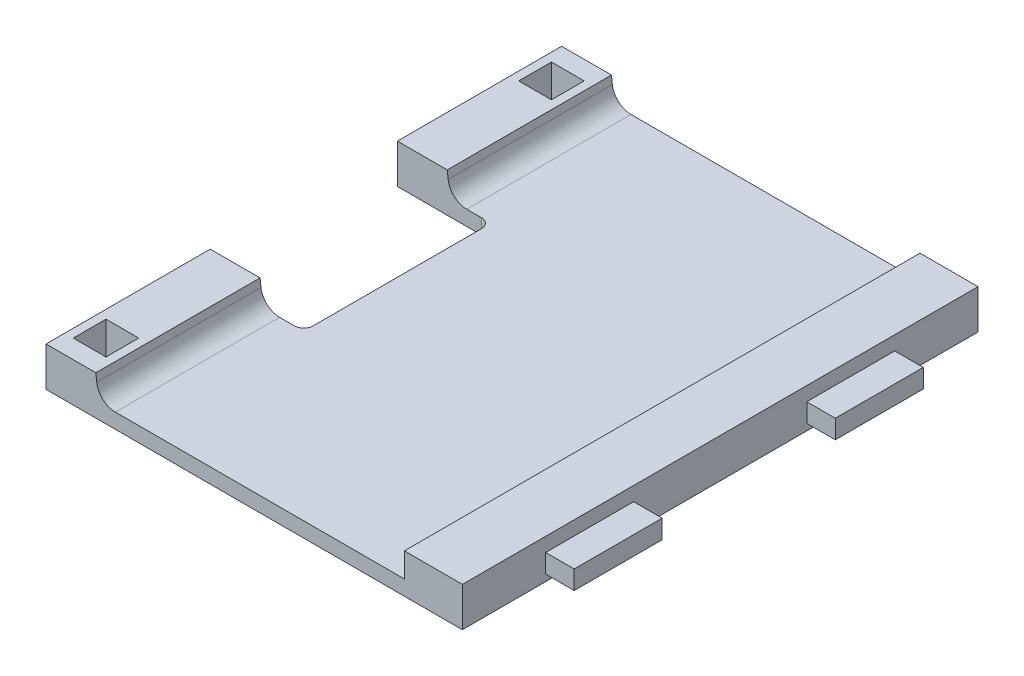
ISO-10303-21;
HEADER;
FILE_DESCRIPTION(('STEP AP214'),'2;1');
FILE_NAME('part.step','',(''),(''),'','','');
FILE_SCHEMA(('AUTOMOTIVE_DESIGN { 1 0 10303 214 1 1 1 1 }'));
ENDSEC;
DATA;
#1=APPLICATION_CONTEXT('core data for automotive mechanical design processes');
#2=APPLICATION_PROTOCOL_DEFINITION('international standard','automotive_design',2000,#1);
#3=PRODUCT_CONTEXT('',#1,'mechanical');
#4=PRODUCT('Part','Part','',(#3));
#5=PRODUCT_RELATED_PRODUCT_CATEGORY('part','',(#4));
#6=PRODUCT_DEFINITION_FORMATION('','',#4);
#7=PRODUCT_DEFINITION_CONTEXT('part definition',#1,'design');
#8=PRODUCT_DEFINITION('design','',#6,#7);
#9=PRODUCT_DEFINITION_SHAPE('','',#8);
#10=(LENGTH_UNIT() NAMED_UNIT(*) SI_UNIT(.MILLI.,.METRE.));
#11=(NAMED_UNIT(*) PLANE_ANGLE_UNIT() SI_UNIT($,.RADIAN.));
#12=(NAMED_UNIT(*) SI_UNIT($,.STERADIAN.) SOLID_ANGLE_UNIT());
#13=UNCERTAINTY_MEASURE_WITH_UNIT(LENGTH_MEASURE(1.E-05),#10,'distance_accuracy_value','');
#14=(GEOMETRIC_REPRESENTATION_CONTEXT(3) GLOBAL_UNCERTAINTY_ASSIGNED_CONTEXT((#13)) GLOBAL_UNIT_ASSIGNED_CONTEXT((#10,
#11,#12)) REPRESENTATION_CONTEXT('',''));
#15=CARTESIAN_POINT('',(0.,0.,0.));
#16=DIRECTION('',(0.,0.,1.));
#17=DIRECTION('',(1.,0.,0.));
#18=AXIS2_PLACEMENT_3D('',#15,#16,#17);
#19=CARTESIAN_POINT('',(3.61456609729862,3.6,55.1));
#20=DIRECTION('',(0.,0.,-1.));
#21=DIRECTION('',(-1.,0.,0.));
#22=AXIS2_PLACEMENT_3D('',#19,#20,#21);
#23=CYLINDRICAL_SURFACE('',#22,2.);
#24=DIRECTION('',(0.,0.,-1.));
#25=VECTOR('',#24,1.);
#26=CARTESIAN_POINT('',(3.61456609729862,1.6,55.1));
#27=LINE('',#26,#25);
#28=CARTESIAN_POINT('',(3.61456609729862,1.6,55.1));
#29=VERTEX_POINT('',#28);
#30=CARTESIAN_POINT('',(3.61456609729862,1.6,37.55));
#31=VERTEX_POINT('',#30);
#32=EDGE_CURVE('E293',#29,#31,#27,.T.);
#33=ORIENTED_EDGE('',*,*,#32,.T.);
#34=CARTESIAN_POINT('',(3.61456609729862,3.6,37.55));
#35=DIRECTION('',(0.,0.,1.));
#36=DIRECTION('',(1.,0.,0.));
#37=AXIS2_PLACEMENT_3D('',#34,#35,#36);
#38=CIRCLE('',#37,2.);
#39=CARTESIAN_POINT('',(1.6278710832653,3.36968951127843,37.55));
#40=VERTEX_POINT('',#39);
#41=EDGE_CURVE('E333',#31,#40,#38,.F.);
#42=ORIENTED_EDGE('',*,*,#41,.T.);
#43=DIRECTION('',(0.,0.,-1.));
#44=VECTOR('',#43,1.);
#45=CARTESIAN_POINT('',(1.6278710832653,3.36968951127843,55.1));
#46=LINE('',#45,#44);
#47=CARTESIAN_POINT('',(1.6278710832653,3.36968951127843,55.1));
#48=VERTEX_POINT('',#47);
#49=EDGE_CURVE('E289',#48,#40,#46,.T.);
#50=ORIENTED_EDGE('',*,*,#49,.F.);
#51=CARTESIAN_POINT('',(3.61456609729862,3.6,55.1));
#52=DIRECTION('',(0.,0.,-1.));
#53=DIRECTION('',(1.,0.,0.));
#54=AXIS2_PLACEMENT_3D('',#51,#52,#53);
#55=CIRCLE('',#54,2.);
#56=EDGE_CURVE('E500',#29,#48,#55,.T.);
#57=ORIENTED_EDGE('',*,*,#56,.F.);
#58=EDGE_LOOP('',(#33,#42,#50,#57));
#59=FACE_BOUND('',#58,.T.);
#60=ADVANCED_FACE('F32',(#59),#23,.F.);
#61=CARTESIAN_POINT('',(1.5316161407113,4.2,55.1));
#62=DIRECTION('',(-0.993347507016657,-0.115155244360784,0.));
#63=DIRECTION('',(0.115155244360784,-0.993347507016658,0.));
#64=AXIS2_PLACEMENT_3D('',#61,#62,#63);
#65=PLANE('',#64);
#66=ORIENTED_EDGE('',*,*,#49,.T.);
#67=DIRECTION('',(-0.115155244360784,0.993347507016658,0.));
#68=VECTOR('',#67,1.);
#69=CARTESIAN_POINT('',(1.5316161407113,4.2,37.55));
#70=LINE('',#69,#68);
#71=CARTESIAN_POINT('',(1.5316161407113,4.2,37.55));
#72=VERTEX_POINT('',#71);
#73=EDGE_CURVE('E356',#40,#72,#70,.T.);
#74=ORIENTED_EDGE('',*,*,#73,.T.);
#75=DIRECTION('',(0.,0.,-1.));
#76=VECTOR('',#75,1.);
#77=CARTESIAN_POINT('',(1.5316161407113,4.2,55.1));
#78=LINE('',#77,#76);
#79=CARTESIAN_POINT('',(1.5316161407113,4.2,55.1));
#80=VERTEX_POINT('',#79);
#81=EDGE_CURVE('E275',#80,#72,#78,.T.);
#82=ORIENTED_EDGE('',*,*,#81,.F.);
#83=DIRECTION('',(-0.115155244360784,0.993347507016657,0.));
#84=VECTOR('',#83,1.);
#85=CARTESIAN_POINT('',(1.5316161407113,4.2,55.1));
#86=LINE('',#85,#84);
#87=EDGE_CURVE('E502',#48,#80,#86,.T.);
#88=ORIENTED_EDGE('',*,*,#87,.F.);
#89=EDGE_LOOP('',(#66,#74,#82,#88));
#90=FACE_BOUND('',#89,.T.);
#91=ADVANCED_FACE('F555',(#90),#65,.F.);
#92=CARTESIAN_POINT('',(1.5316161407113,4.2,55.1));
#93=DIRECTION('',(0.,-1.,0.));
#94=DIRECTION('',(1.,0.,0.));
#95=AXIS2_PLACEMENT_3D('',#92,#93,#94);
#96=PLANE('',#95);
#97=DIRECTION('',(0.,0.,-1.));
#98=VECTOR('',#97,1.);
#99=CARTESIAN_POINT('',(0.617801140711291,4.2,53.1));
#100=LINE('',#99,#98);
#101=CARTESIAN_POINT('',(0.617801140711291,4.2,53.1));
#102=VERTEX_POINT('',#101);
#103=CARTESIAN_POINT('',(0.617801140711291,4.2,49.6));
#104=VERTEX_POINT('',#103);
#105=EDGE_CURVE('E375',#102,#104,#100,.T.);
#106=ORIENTED_EDGE('',*,*,#105,.F.);
#107=DIRECTION('',(1.,0.,0.));
#108=VECTOR('',#107,1.);
#109=CARTESIAN_POINT('',(-2.88219885928871,4.2,53.1));
#110=LINE('',#109,#108);
#111=CARTESIAN_POINT('',(-2.88219885928871,4.2,53.1));
#112=VERTEX_POINT('',#111);
#113=EDGE_CURVE('E373',#112,#102,#110,.T.);
#114=ORIENTED_EDGE('',*,*,#113,.F.);
#115=DIRECTION('',(0.,0.,1.));
#116=VECTOR('',#115,1.);
#117=CARTESIAN_POINT('',(-2.88219885928871,4.2,53.1));
#118=LINE('',#117,#116);
#119=CARTESIAN_POINT('',(-2.88219885928871,4.2,49.6));
#120=VERTEX_POINT('',#119);
#121=EDGE_CURVE('E363',#120,#112,#118,.T.);
#122=ORIENTED_EDGE('',*,*,#121,.F.);
#123=DIRECTION('',(-1.,0.,0.));
#124=VECTOR('',#123,1.);
#125=CARTESIAN_POINT('',(0.617801140711291,4.2,49.6));
#126=LINE('',#125,#124);
#127=EDGE_CURVE('E379',#104,#120,#126,.T.);
#128=ORIENTED_EDGE('',*,*,#127,.F.);
#129=EDGE_LOOP('',(#106,#114,#122,#128));
#130=FACE_BOUND('',#129,.T.);
#131=ORIENTED_EDGE('',*,*,#81,.T.);
#132=DIRECTION('',(-1.,0.,0.));
#133=VECTOR('',#132,1.);
#134=CARTESIAN_POINT('',(-3.79601385928872,4.2,37.55));
#135=LINE('',#134,#133);
#136=CARTESIAN_POINT('',(-3.79601385928872,4.2,37.55));
#137=VERTEX_POINT('',#136);
#138=EDGE_CURVE('E255',#72,#137,#135,.T.);
#139=ORIENTED_EDGE('',*,*,#138,.T.);
#140=DIRECTION('',(0.,0.,-1.));
#141=VECTOR('',#140,1.);
#142=CARTESIAN_POINT('',(-3.79601385928872,4.19999999999999,55.1));
#143=LINE('',#142,#141);
#144=CARTESIAN_POINT('',(-3.79601385928872,4.19999999999999,55.1));
#145=VERTEX_POINT('',#144);
#146=EDGE_CURVE('E272',#145,#137,#143,.T.);
#147=ORIENTED_EDGE('',*,*,#146,.F.);
#148=DIRECTION('',(-1.,0.,0.));
#149=VECTOR('',#148,1.);
#150=CARTESIAN_POINT('',(1.5316161407113,4.2,55.1));
#151=LINE('',#150,#149);
#152=EDGE_CURVE('E504',#80,#145,#151,.T.);
#153=ORIENTED_EDGE('',*,*,#152,.F.);
#154=EDGE_LOOP('',(#131,#139,#147,#153));
#155=FACE_BOUND('',#154,.T.);
#156=ADVANCED_FACE('F270',(#130,#155),#96,.F.);
#157=CARTESIAN_POINT('',(-3.79601385928872,4.19999999999999,55.1));
#158=DIRECTION('',(1.,0.,0.));
#159=DIRECTION('',(0.,0.,-1.));
#160=AXIS2_PLACEMENT_3D('',#157,#158,#159);
#161=PLANE('',#160);
#162=ORIENTED_EDGE('',*,*,#146,.T.);
#163=DIRECTION('',(0.,-1.,0.));
#164=VECTOR('',#163,1.);
#165=CARTESIAN_POINT('',(-3.79601385928872,4.2,37.55));
#166=LINE('',#165,#164);
#167=CARTESIAN_POINT('',(-3.79601385928872,0.,37.55));
#168=VERTEX_POINT('',#167);
#169=EDGE_CURVE('E251',#137,#168,#166,.T.);
#170=ORIENTED_EDGE('',*,*,#169,.T.);
#171=DIRECTION('',(0.,0.,-1.));
#172=VECTOR('',#171,1.);
#173=CARTESIAN_POINT('',(-3.79601385928872,0.,55.1));
#174=LINE('',#173,#172);
#175=CARTESIAN_POINT('',(-3.79601385928872,0.,55.1));
#176=VERTEX_POINT('',#175);
#177=EDGE_CURVE('E284',#176,#168,#174,.T.);
#178=ORIENTED_EDGE('',*,*,#177,.F.);
#179=DIRECTION('',(0.,-1.,0.));
#180=VECTOR('',#179,1.);
#181=CARTESIAN_POINT('',(-3.79601385928872,4.19999999999999,55.1));
#182=LINE('',#181,#180);
#183=EDGE_CURVE('E279',#145,#176,#182,.T.);
#184=ORIENTED_EDGE('',*,*,#183,.F.);
#185=EDGE_LOOP('',(#162,#170,#178,#184));
#186=FACE_BOUND('',#185,.T.);
#187=ADVANCED_FACE('F278',(#186),#161,.F.);
#188=CARTESIAN_POINT('',(40.7,0.,55.1));
#189=DIRECTION('',(-1.,0.,0.));
#190=DIRECTION('',(0.,-1.,0.));
#191=AXIS2_PLACEMENT_3D('',#188,#189,#190);
#192=PLANE('',#191);
#193=DIRECTION('',(0.,-1.,0.));
#194=VECTOR('',#193,1.);
#195=CARTESIAN_POINT('',(40.7,2.69999999999993,18.3));
#196=LINE('',#195,#194);
#197=CARTESIAN_POINT('',(40.7,2.69999999999993,18.3));
#198=VERTEX_POINT('',#197);
#199=CARTESIAN_POINT('',(40.7,0.699999999999933,18.3));
#200=VERTEX_POINT('',#199);
#201=EDGE_CURVE('E455',#198,#200,#196,.T.);
#202=ORIENTED_EDGE('',*,*,#201,.F.);
#203=DIRECTION('',(0.,0.,1.));
#204=VECTOR('',#203,1.);
#205=CARTESIAN_POINT('',(40.7,2.69999999999993,18.3));
#206=LINE('',#205,#204);
#207=CARTESIAN_POINT('',(40.7,2.69999999999993,8.9));
#208=VERTEX_POINT('',#207);
#209=EDGE_CURVE('E460',#208,#198,#206,.T.);
#210=ORIENTED_EDGE('',*,*,#209,.F.);
#211=DIRECTION('',(0.,1.,0.));
#212=VECTOR('',#211,1.);
#213=CARTESIAN_POINT('',(40.7,2.69999999999993,8.9));
#214=LINE('',#213,#212);
#215=CARTESIAN_POINT('',(40.7,0.699999999999928,8.9));
#216=VERTEX_POINT('',#215);
#217=EDGE_CURVE('E472',#216,#208,#214,.T.);
#218=ORIENTED_EDGE('',*,*,#217,.F.);
#219=DIRECTION('',(0.,0.,-1.));
#220=VECTOR('',#219,1.);
#221=CARTESIAN_POINT('',(40.7,0.699999999999933,18.3));
#222=LINE('',#221,#220);
#223=EDGE_CURVE('E469',#200,#216,#222,.T.);
#224=ORIENTED_EDGE('',*,*,#223,.F.);
#225=EDGE_LOOP('',(#202,#210,#218,#224));
#226=FACE_BOUND('',#225,.T.);
#227=DIRECTION('',(0.,1.,0.));
#228=VECTOR('',#227,1.);
#229=CARTESIAN_POINT('',(40.7,0.,0.));
#230=LINE('',#229,#228);
#231=CARTESIAN_POINT('',(40.7,0.,0.));
#232=VERTEX_POINT('',#231);
#233=CARTESIAN_POINT('',(40.7,4.2,0.));
#234=VERTEX_POINT('',#233);
#235=EDGE_CURVE('E509',#232,#234,#230,.T.);
#236=ORIENTED_EDGE('',*,*,#235,.T.);
#237=DIRECTION('',(0.,0.,-1.));
#238=VECTOR('',#237,1.);
#239=CARTESIAN_POINT('',(40.7,4.2,55.1));
#240=LINE('',#239,#238);
#241=CARTESIAN_POINT('',(40.7,4.2,55.1));
#242=VERTEX_POINT('',#241);
#243=EDGE_CURVE('E302',#242,#234,#240,.T.);
#244=ORIENTED_EDGE('',*,*,#243,.F.);
#245=DIRECTION('',(0.,1.,0.));
#246=VECTOR('',#245,1.);
#247=CARTESIAN_POINT('',(40.7,0.,55.1));
#248=LINE('',#247,#246);
#249=CARTESIAN_POINT('',(40.7,0.,55.1));
#250=VERTEX_POINT('',#249);
#251=EDGE_CURVE('E491',#250,#242,#248,.T.);
#252=ORIENTED_EDGE('',*,*,#251,.F.);
#253=DIRECTION('',(0.,0.,-1.));
#254=VECTOR('',#253,1.);
#255=CARTESIAN_POINT('',(40.7,0.,55.1));
#256=LINE('',#255,#254);
#257=EDGE_CURVE('E305',#250,#232,#256,.T.);
#258=ORIENTED_EDGE('',*,*,#257,.T.);
#259=EDGE_LOOP('',(#236,#244,#252,#258));
#260=FACE_BOUND('',#259,.T.);
#261=DIRECTION('',(0.,1.,0.));
#262=VECTOR('',#261,1.);
#263=CARTESIAN_POINT('',(40.7,2.69999999999993,36.8));
#264=LINE('',#263,#262);
#265=CARTESIAN_POINT('',(40.7,0.699999999999933,36.8));
#266=VERTEX_POINT('',#265);
#267=CARTESIAN_POINT('',(40.7,2.69999999999993,36.8));
#268=VERTEX_POINT('',#267);
#269=EDGE_CURVE('E386',#266,#268,#264,.T.);
#270=ORIENTED_EDGE('',*,*,#269,.F.);
#271=DIRECTION('',(0.,0.,-1.));
#272=VECTOR('',#271,1.);
#273=CARTESIAN_POINT('',(40.7,0.699999999999933,36.8));
#274=LINE('',#273,#272);
#275=CARTESIAN_POINT('',(40.7,0.699999999999933,46.2));
#276=VERTEX_POINT('',#275);
#277=EDGE_CURVE('E427',#276,#266,#274,.T.);
#278=ORIENTED_EDGE('',*,*,#277,.F.);
#279=DIRECTION('',(0.,-1.,0.));
#280=VECTOR('',#279,1.);
#281=CARTESIAN_POINT('',(40.7,2.69999999999993,46.2));
#282=LINE('',#281,#280);
#283=CARTESIAN_POINT('',(40.7,2.69999999999993,46.2));
#284=VERTEX_POINT('',#283);
#285=EDGE_CURVE('E439',#284,#276,#282,.T.);
#286=ORIENTED_EDGE('',*,*,#285,.F.);
#287=DIRECTION('',(0.,0.,1.));
#288=VECTOR('',#287,1.);
#289=CARTESIAN_POINT('',(40.7,2.69999999999993,36.8));
#290=LINE('',#289,#288);
#291=EDGE_CURVE('E436',#268,#284,#290,.T.);
#292=ORIENTED_EDGE('',*,*,#291,.F.);
#293=EDGE_LOOP('',(#270,#278,#286,#292));
#294=FACE_BOUND('',#293,.T.);
#295=ADVANCED_FACE('F544',(#226,#260,#294),#192,.F.);
#296=CARTESIAN_POINT('',(0.,0.,55.1));
#297=DIRECTION('',(0.,1.,0.));
#298=DIRECTION('',(0.,0.,1.));
#299=AXIS2_PLACEMENT_3D('',#296,#297,#298);
#300=PLANE('',#299);
#301=ORIENTED_EDGE('',*,*,#177,.T.);
#302=DIRECTION('',(-1.,0.,0.));
#303=VECTOR('',#302,1.);
#304=CARTESIAN_POINT('',(-3.79601385928872,0.,37.55));
#305=LINE('',#304,#303);
#306=CARTESIAN_POINT('',(5.20398614071128,0.,37.55));
#307=VERTEX_POINT('',#306);
#308=EDGE_CURVE('E259',#307,#168,#305,.T.);
#309=ORIENTED_EDGE('',*,*,#308,.F.);
#310=CARTESIAN_POINT('',(5.20398614071128,0.,36.55));
#311=DIRECTION('',(0.,1.,0.));
#312=DIRECTION('',(0.,0.,1.));
#313=AXIS2_PLACEMENT_3D('',#310,#311,#312);
#314=CIRCLE('',#313,1.);
#315=CARTESIAN_POINT('',(6.20398614071128,0.,36.55));
#316=VERTEX_POINT('',#315);
#317=EDGE_CURVE('E319',#307,#316,#314,.T.);
#318=ORIENTED_EDGE('',*,*,#317,.T.);
#319=DIRECTION('',(0.,0.,1.));
#320=VECTOR('',#319,1.);
#321=CARTESIAN_POINT('',(6.20398614071128,0.,37.55));
#322=LINE('',#321,#320);
#323=CARTESIAN_POINT('',(6.20398614071129,0.,18.55));
#324=VERTEX_POINT('',#323);
#325=EDGE_CURVE('E339',#324,#316,#322,.T.);
#326=ORIENTED_EDGE('',*,*,#325,.F.);
#327=CARTESIAN_POINT('',(5.20398614071129,0.,18.55));
#328=DIRECTION('',(0.,1.,0.));
#329=DIRECTION('',(0.,0.,1.));
#330=AXIS2_PLACEMENT_3D('',#327,#328,#329);
#331=CIRCLE('',#330,1.);
#332=CARTESIAN_POINT('',(5.20398614071129,0.,17.55));
#333=VERTEX_POINT('',#332);
#334=EDGE_CURVE('E40',#324,#333,#331,.T.);
#335=ORIENTED_EDGE('',*,*,#334,.T.);
#336=DIRECTION('',(1.,0.,0.));
#337=VECTOR('',#336,1.);
#338=CARTESIAN_POINT('',(-3.79601385928872,0.,17.55));
#339=LINE('',#338,#337);
#340=CARTESIAN_POINT('',(-3.79601385928872,0.,17.55));
#341=VERTEX_POINT('',#340);
#342=EDGE_CURVE('E343',#341,#333,#339,.T.);
#343=ORIENTED_EDGE('',*,*,#342,.F.);
#344=CARTESIAN_POINT('',(-3.79601385928872,0.,0.));
#345=VERTEX_POINT('',#344);
#346=EDGE_CURVE('E507',#341,#345,#174,.T.);
#347=ORIENTED_EDGE('',*,*,#346,.T.);
#348=DIRECTION('',(1.,0.,0.));
#349=VECTOR('',#348,1.);
#350=CARTESIAN_POINT('',(0.,0.,0.));
#351=LINE('',#350,#349);
#352=EDGE_CURVE('E488',#345,#232,#351,.T.);
#353=ORIENTED_EDGE('',*,*,#352,.T.);
#354=ORIENTED_EDGE('',*,*,#257,.F.);
#355=DIRECTION('',(1.,0.,0.));
#356=VECTOR('',#355,1.);
#357=CARTESIAN_POINT('',(0.,0.,55.1));
#358=LINE('',#357,#356);
#359=EDGE_CURVE('E489',#176,#250,#358,.T.);
#360=ORIENTED_EDGE('',*,*,#359,.F.);
#361=EDGE_LOOP('',(#301,#309,#318,#326,#335,#343,#347,#353,#354,#360));
#362=FACE_BOUND('',#361,.T.);
#363=ADVANCED_FACE('F338',(#362),#300,.F.);
#364=CARTESIAN_POINT('',(40.7,4.2,55.1));
#365=DIRECTION('',(0.,-1.,0.));
#366=DIRECTION('',(1.,0.,0.));
#367=AXIS2_PLACEMENT_3D('',#364,#365,#366);
#368=PLANE('',#367);
#369=DIRECTION('',(-1.,0.,0.));
#370=VECTOR('',#369,1.);
#371=CARTESIAN_POINT('',(40.7,4.2,0.));
#372=LINE('',#371,#370);
#373=CARTESIAN_POINT('',(34.5,4.2,0.));
#374=VERTEX_POINT('',#373);
#375=EDGE_CURVE('E511',#234,#374,#372,.T.);
#376=ORIENTED_EDGE('',*,*,#375,.T.);
#377=DIRECTION('',(0.,0.,-1.));
#378=VECTOR('',#377,1.);
#379=CARTESIAN_POINT('',(34.5,4.2,55.1));
#380=LINE('',#379,#378);
#381=CARTESIAN_POINT('',(34.5,4.2,55.1));
#382=VERTEX_POINT('',#381);
#383=EDGE_CURVE('E299',#382,#374,#380,.T.);
#384=ORIENTED_EDGE('',*,*,#383,.F.);
#385=DIRECTION('',(-1.,0.,0.));
#386=VECTOR('',#385,1.);
#387=CARTESIAN_POINT('',(40.7,4.2,55.1));
#388=LINE('',#387,#386);
#389=EDGE_CURVE('E494',#242,#382,#388,.T.);
#390=ORIENTED_EDGE('',*,*,#389,.F.);
#391=ORIENTED_EDGE('',*,*,#243,.T.);
#392=EDGE_LOOP('',(#376,#384,#390,#391));
#393=FACE_BOUND('',#392,.T.);
#394=ADVANCED_FACE('F598',(#393),#368,.F.);
#395=CARTESIAN_POINT('',(34.5,4.2,55.1));
#396=DIRECTION('',(1.,0.,0.));
#397=DIRECTION('',(0.,0.,-1.));
#398=AXIS2_PLACEMENT_3D('',#395,#396,#397);
#399=PLANE('',#398);
#400=DIRECTION('',(0.,-1.,0.));
#401=VECTOR('',#400,1.);
#402=CARTESIAN_POINT('',(34.5,4.2,0.));
#403=LINE('',#402,#401);
#404=CARTESIAN_POINT('',(34.5,1.6,0.));
#405=VERTEX_POINT('',#404);
#406=EDGE_CURVE('E513',#374,#405,#403,.T.);
#407=ORIENTED_EDGE('',*,*,#406,.T.);
#408=DIRECTION('',(0.,0.,-1.));
#409=VECTOR('',#408,1.);
#410=CARTESIAN_POINT('',(34.5,1.6,55.1));
#411=LINE('',#410,#409);
#412=CARTESIAN_POINT('',(34.5,1.6,55.1));
#413=VERTEX_POINT('',#412);
#414=EDGE_CURVE('E296',#413,#405,#411,.T.);
#415=ORIENTED_EDGE('',*,*,#414,.F.);
#416=DIRECTION('',(0.,-1.,0.));
#417=VECTOR('',#416,1.);
#418=CARTESIAN_POINT('',(34.5,4.2,55.1));
#419=LINE('',#418,#417);
#420=EDGE_CURVE('E496',#382,#413,#419,.T.);
#421=ORIENTED_EDGE('',*,*,#420,.F.);
#422=ORIENTED_EDGE('',*,*,#383,.T.);
#423=EDGE_LOOP('',(#407,#415,#421,#422));
#424=FACE_BOUND('',#423,.T.);
#425=ADVANCED_FACE('F562',(#424),#399,.F.);
#426=CARTESIAN_POINT('',(34.5,1.6,55.1));
#427=DIRECTION('',(0.,-1.,0.));
#428=DIRECTION('',(1.,0.,0.));
#429=AXIS2_PLACEMENT_3D('',#426,#427,#428);
#430=PLANE('',#429);
#431=DIRECTION('',(1.,0.,0.));
#432=VECTOR('',#431,1.);
#433=CARTESIAN_POINT('',(34.5,1.6,17.55));
#434=LINE('',#433,#432);
#435=CARTESIAN_POINT('',(3.61456609729862,1.6,17.55));
#436=VERTEX_POINT('',#435);
#437=CARTESIAN_POINT('',(5.20398614071129,1.6,17.55));
#438=VERTEX_POINT('',#437);
#439=EDGE_CURVE('E354',#436,#438,#434,.T.);
#440=ORIENTED_EDGE('',*,*,#439,.T.);
#441=CARTESIAN_POINT('',(5.20398614071129,1.6,18.55));
#442=DIRECTION('',(0.,-1.,0.));
#443=DIRECTION('',(1.,0.,0.));
#444=AXIS2_PLACEMENT_3D('',#441,#442,#443);
#445=CIRCLE('',#444,1.);
#446=CARTESIAN_POINT('',(6.20398614071128,1.6,18.55));
#447=VERTEX_POINT('',#446);
#448=EDGE_CURVE('E11',#438,#447,#445,.T.);
#449=ORIENTED_EDGE('',*,*,#448,.T.);
#450=DIRECTION('',(0.,0.,1.));
#451=VECTOR('',#450,1.);
#452=CARTESIAN_POINT('',(6.20398614071127,1.6,55.1));
#453=LINE('',#452,#451);
#454=CARTESIAN_POINT('',(6.20398614071128,1.6,36.55));
#455=VERTEX_POINT('',#454);
#456=EDGE_CURVE('E308',#447,#455,#453,.T.);
#457=ORIENTED_EDGE('',*,*,#456,.T.);
#458=CARTESIAN_POINT('',(5.20398614071128,1.6,36.55));
#459=DIRECTION('',(0.,-1.,0.));
#460=DIRECTION('',(1.,0.,0.));
#461=AXIS2_PLACEMENT_3D('',#458,#459,#460);
#462=CIRCLE('',#461,1.);
#463=CARTESIAN_POINT('',(5.20398614071128,1.6,37.55));
#464=VERTEX_POINT('',#463);
#465=EDGE_CURVE('E321',#455,#464,#462,.T.);
#466=ORIENTED_EDGE('',*,*,#465,.T.);
#467=DIRECTION('',(-1.,0.,0.));
#468=VECTOR('',#467,1.);
#469=CARTESIAN_POINT('',(34.5,1.6,37.55));
#470=LINE('',#469,#468);
#471=EDGE_CURVE('E326',#464,#31,#470,.T.);
#472=ORIENTED_EDGE('',*,*,#471,.T.);
#473=ORIENTED_EDGE('',*,*,#32,.F.);
#474=DIRECTION('',(-1.,0.,0.));
#475=VECTOR('',#474,1.);
#476=CARTESIAN_POINT('',(34.5,1.6,55.1));
#477=LINE('',#476,#475);
#478=EDGE_CURVE('E498',#413,#29,#477,.T.);
#479=ORIENTED_EDGE('',*,*,#478,.F.);
#480=ORIENTED_EDGE('',*,*,#414,.T.);
#481=DIRECTION('',(-1.,0.,0.));
#482=VECTOR('',#481,1.);
#483=CARTESIAN_POINT('',(34.5,1.6,0.));
#484=LINE('',#483,#482);
#485=CARTESIAN_POINT('',(3.61456609729862,1.6,0.));
#486=VERTEX_POINT('',#485);
#487=EDGE_CURVE('E515',#405,#486,#484,.T.);
#488=ORIENTED_EDGE('',*,*,#487,.T.);
#489=EDGE_CURVE('E292',#436,#486,#27,.T.);
#490=ORIENTED_EDGE('',*,*,#489,.F.);
#491=EDGE_LOOP('',(#440,#449,#457,#466,#472,#473,#479,#480,#488,#490));
#492=FACE_BOUND('',#491,.T.);
#493=ADVANCED_FACE('F324',(#492),#430,.F.);
#494=CARTESIAN_POINT('',(1.6278710832653,3.36968951127843,17.55));
#495=VERTEX_POINT('',#494);
#496=CARTESIAN_POINT('',(1.6278710832653,3.36968951127843,0.));
#497=VERTEX_POINT('',#496);
#498=EDGE_CURVE('E288',#495,#497,#46,.T.);
#499=ORIENTED_EDGE('',*,*,#498,.F.);
#500=CARTESIAN_POINT('',(3.61456609729862,3.6,17.55));
#501=DIRECTION('',(0.,0.,-1.));
#502=DIRECTION('',(-1.,0.,0.));
#503=AXIS2_PLACEMENT_3D('',#500,#501,#502);
#504=CIRCLE('',#503,2.);
#505=EDGE_CURVE('E351',#495,#436,#504,.F.);
#506=ORIENTED_EDGE('',*,*,#505,.T.);
#507=ORIENTED_EDGE('',*,*,#489,.T.);
#508=CARTESIAN_POINT('',(3.61456609729862,3.6,0.));
#509=DIRECTION('',(0.,0.,-1.));
#510=DIRECTION('',(1.,0.,0.));
#511=AXIS2_PLACEMENT_3D('',#508,#509,#510);
#512=CIRCLE('',#511,2.);
#513=EDGE_CURVE('E518',#486,#497,#512,.T.);
#514=ORIENTED_EDGE('',*,*,#513,.T.);
#515=EDGE_LOOP('',(#499,#506,#507,#514));
#516=FACE_BOUND('',#515,.T.);
#517=ADVANCED_FACE('F569',(#516),#23,.F.);
#518=CARTESIAN_POINT('',(1.5316161407113,4.2,17.55));
#519=VERTEX_POINT('',#518);
#520=CARTESIAN_POINT('',(1.5316161407113,4.2,0.));
#521=VERTEX_POINT('',#520);
#522=EDGE_CURVE('E280',#519,#521,#78,.T.);
#523=ORIENTED_EDGE('',*,*,#522,.F.);
#524=DIRECTION('',(0.115155244360784,-0.993347507016658,0.));
#525=VECTOR('',#524,1.);
#526=CARTESIAN_POINT('',(1.5316161407113,4.2,17.55));
#527=LINE('',#526,#525);
#528=EDGE_CURVE('E264',#519,#495,#527,.T.);
#529=ORIENTED_EDGE('',*,*,#528,.T.);
#530=ORIENTED_EDGE('',*,*,#498,.T.);
#531=DIRECTION('',(-0.115155244360784,0.993347507016657,0.));
#532=VECTOR('',#531,1.);
#533=CARTESIAN_POINT('',(1.5316161407113,4.2,0.));
#534=LINE('',#533,#532);
#535=EDGE_CURVE('E521',#497,#521,#534,.T.);
#536=ORIENTED_EDGE('',*,*,#535,.T.);
#537=EDGE_LOOP('',(#523,#529,#530,#536));
#538=FACE_BOUND('',#537,.T.);
#539=ADVANCED_FACE('F574',(#538),#65,.F.);
#540=DIRECTION('',(1.,0.,0.));
#541=VECTOR('',#540,1.);
#542=CARTESIAN_POINT('',(0.617801140711291,4.2,5.50000000000001));
#543=LINE('',#542,#541);
#544=CARTESIAN_POINT('',(-2.88219885928871,4.2,5.50000000000001));
#545=VERTEX_POINT('',#544);
#546=CARTESIAN_POINT('',(0.617801140711291,4.2,5.50000000000001));
#547=VERTEX_POINT('',#546);
#548=EDGE_CURVE('E408',#545,#547,#543,.T.);
#549=ORIENTED_EDGE('',*,*,#548,.F.);
#550=DIRECTION('',(0.,0.,1.));
#551=VECTOR('',#550,1.);
#552=CARTESIAN_POINT('',(-2.88219885928871,4.2,2.));
#553=LINE('',#552,#551);
#554=CARTESIAN_POINT('',(-2.88219885928871,4.2,2.));
#555=VERTEX_POINT('',#554);
#556=EDGE_CURVE('E334',#555,#545,#553,.T.);
#557=ORIENTED_EDGE('',*,*,#556,.F.);
#558=DIRECTION('',(-1.,0.,0.));
#559=VECTOR('',#558,1.);
#560=CARTESIAN_POINT('',(-2.88219885928871,4.2,2.));
#561=LINE('',#560,#559);
#562=CARTESIAN_POINT('',(0.617801140711291,4.2,2.));
#563=VERTEX_POINT('',#562);
#564=EDGE_CURVE('E397',#563,#555,#561,.T.);
#565=ORIENTED_EDGE('',*,*,#564,.F.);
#566=DIRECTION('',(0.,0.,-1.));
#567=VECTOR('',#566,1.);
#568=CARTESIAN_POINT('',(0.617801140711291,4.2,2.));
#569=LINE('',#568,#567);
#570=EDGE_CURVE('E411',#547,#563,#569,.T.);
#571=ORIENTED_EDGE('',*,*,#570,.F.);
#572=EDGE_LOOP('',(#549,#557,#565,#571));
#573=FACE_BOUND('',#572,.T.);
#574=CARTESIAN_POINT('',(-3.79601385928872,4.19999999999999,17.55));
#575=VERTEX_POINT('',#574);
#576=CARTESIAN_POINT('',(-3.79601385928872,4.19999999999999,0.));
#577=VERTEX_POINT('',#576);
#578=EDGE_CURVE('E281',#575,#577,#143,.T.);
#579=ORIENTED_EDGE('',*,*,#578,.F.);
#580=DIRECTION('',(1.,0.,0.));
#581=VECTOR('',#580,1.);
#582=CARTESIAN_POINT('',(-3.79601385928872,4.2,17.55));
#583=LINE('',#582,#581);
#584=EDGE_CURVE('E276',#575,#519,#583,.T.);
#585=ORIENTED_EDGE('',*,*,#584,.T.);
#586=ORIENTED_EDGE('',*,*,#522,.T.);
#587=DIRECTION('',(-1.,0.,0.));
#588=VECTOR('',#587,1.);
#589=CARTESIAN_POINT('',(1.5316161407113,4.2,0.));
#590=LINE('',#589,#588);
#591=EDGE_CURVE('E524',#521,#577,#590,.T.);
#592=ORIENTED_EDGE('',*,*,#591,.T.);
#593=EDGE_LOOP('',(#579,#585,#586,#592));
#594=FACE_BOUND('',#593,.T.);
#595=ADVANCED_FACE('F576',(#573,#594),#96,.F.);
#596=ORIENTED_EDGE('',*,*,#346,.F.);
#597=DIRECTION('',(0.,-1.,0.));
#598=VECTOR('',#597,1.);
#599=CARTESIAN_POINT('',(-3.79601385928872,4.2,17.55));
#600=LINE('',#599,#598);
#601=EDGE_CURVE('E265',#575,#341,#600,.T.);
#602=ORIENTED_EDGE('',*,*,#601,.F.);
#603=ORIENTED_EDGE('',*,*,#578,.T.);
#604=DIRECTION('',(0.,-1.,0.));
#605=VECTOR('',#604,1.);
#606=CARTESIAN_POINT('',(-3.79601385928872,4.19999999999999,0.));
#607=LINE('',#606,#605);
#608=EDGE_CURVE('E492',#577,#345,#607,.T.);
#609=ORIENTED_EDGE('',*,*,#608,.T.);
#610=EDGE_LOOP('',(#596,#602,#603,#609));
#611=FACE_BOUND('',#610,.T.);
#612=ADVANCED_FACE('F530',(#611),#161,.F.);
#613=CARTESIAN_POINT('',(3.61456609729862,3.6,55.1));
#614=DIRECTION('',(0.,0.,1.));
#615=DIRECTION('',(1.,0.,0.));
#616=AXIS2_PLACEMENT_3D('',#613,#614,#615);
#617=PLANE('',#616);
#618=ORIENTED_EDGE('',*,*,#359,.T.);
#619=ORIENTED_EDGE('',*,*,#251,.T.);
#620=ORIENTED_EDGE('',*,*,#389,.T.);
#621=ORIENTED_EDGE('',*,*,#420,.T.);
#622=ORIENTED_EDGE('',*,*,#478,.T.);
#623=ORIENTED_EDGE('',*,*,#56,.T.);
#624=ORIENTED_EDGE('',*,*,#87,.T.);
#625=ORIENTED_EDGE('',*,*,#152,.T.);
#626=ORIENTED_EDGE('',*,*,#183,.T.);
#627=EDGE_LOOP('',(#618,#619,#620,#621,#622,#623,#624,#625,#626));
#628=FACE_BOUND('',#627,.T.);
#629=ADVANCED_FACE('F549',(#628),#617,.T.);
#630=CARTESIAN_POINT('',(3.61456609729862,3.6,0.));
#631=DIRECTION('',(0.,0.,1.));
#632=DIRECTION('',(1.,0.,0.));
#633=AXIS2_PLACEMENT_3D('',#630,#631,#632);
#634=PLANE('',#633);
#635=ORIENTED_EDGE('',*,*,#352,.F.);
#636=ORIENTED_EDGE('',*,*,#608,.F.);
#637=ORIENTED_EDGE('',*,*,#591,.F.);
#638=ORIENTED_EDGE('',*,*,#535,.F.);
#639=ORIENTED_EDGE('',*,*,#513,.F.);
#640=ORIENTED_EDGE('',*,*,#487,.F.);
#641=ORIENTED_EDGE('',*,*,#406,.F.);
#642=ORIENTED_EDGE('',*,*,#375,.F.);
#643=ORIENTED_EDGE('',*,*,#235,.F.);
#644=EDGE_LOOP('',(#635,#636,#637,#638,#639,#640,#641,#642,#643));
#645=FACE_BOUND('',#644,.T.);
#646=ADVANCED_FACE('F536',(#645),#634,.F.);
#647=CARTESIAN_POINT('',(43.75,2.69999999999993,18.3));
#648=DIRECTION('',(0.,0.,-1.));
#649=DIRECTION('',(-1.,0.,0.));
#650=AXIS2_PLACEMENT_3D('',#647,#648,#649);
#651=PLANE('',#650);
#652=ORIENTED_EDGE('',*,*,#201,.T.);
#653=DIRECTION('',(-1.,0.,0.));
#654=VECTOR('',#653,1.);
#655=CARTESIAN_POINT('',(43.75,0.699999999999928,18.3));
#656=LINE('',#655,#654);
#657=CARTESIAN_POINT('',(43.75,0.699999999999928,18.3));
#658=VERTEX_POINT('',#657);
#659=EDGE_CURVE('E485',#658,#200,#656,.T.);
#660=ORIENTED_EDGE('',*,*,#659,.F.);
#661=DIRECTION('',(0.,-1.,0.));
#662=VECTOR('',#661,1.);
#663=CARTESIAN_POINT('',(43.75,2.69999999999993,18.3));
#664=LINE('',#663,#662);
#665=CARTESIAN_POINT('',(43.75,2.69999999999993,18.3));
#666=VERTEX_POINT('',#665);
#667=EDGE_CURVE('E456',#666,#658,#664,.T.);
#668=ORIENTED_EDGE('',*,*,#667,.F.);
#669=DIRECTION('',(-1.,0.,0.));
#670=VECTOR('',#669,1.);
#671=CARTESIAN_POINT('',(43.75,2.69999999999993,18.3));
#672=LINE('',#671,#670);
#673=EDGE_CURVE('E466',#666,#198,#672,.T.);
#674=ORIENTED_EDGE('',*,*,#673,.T.);
#675=EDGE_LOOP('',(#652,#660,#668,#674));
#676=FACE_BOUND('',#675,.T.);
#677=ADVANCED_FACE('F641',(#676),#651,.F.);
#678=CARTESIAN_POINT('',(43.75,0.699999999999928,18.3));
#679=DIRECTION('',(0.,1.,0.));
#680=DIRECTION('',(-1.,0.,0.));
#681=AXIS2_PLACEMENT_3D('',#678,#679,#680);
#682=PLANE('',#681);
#683=ORIENTED_EDGE('',*,*,#223,.T.);
#684=DIRECTION('',(-1.,0.,0.));
#685=VECTOR('',#684,1.);
#686=CARTESIAN_POINT('',(43.75,0.699999999999928,8.9));
#687=LINE('',#686,#685);
#688=CARTESIAN_POINT('',(43.75,0.699999999999928,8.9));
#689=VERTEX_POINT('',#688);
#690=EDGE_CURVE('E482',#689,#216,#687,.T.);
#691=ORIENTED_EDGE('',*,*,#690,.F.);
#692=DIRECTION('',(0.,0.,-1.));
#693=VECTOR('',#692,1.);
#694=CARTESIAN_POINT('',(43.75,0.699999999999928,18.3));
#695=LINE('',#694,#693);
#696=EDGE_CURVE('E459',#658,#689,#695,.T.);
#697=ORIENTED_EDGE('',*,*,#696,.F.);
#698=ORIENTED_EDGE('',*,*,#659,.T.);
#699=EDGE_LOOP('',(#683,#691,#697,#698));
#700=FACE_BOUND('',#699,.T.);
#701=ADVANCED_FACE('F655',(#700),#682,.F.);
#702=CARTESIAN_POINT('',(43.75,2.69999999999993,8.9));
#703=DIRECTION('',(0.,0.,1.));
#704=DIRECTION('',(1.,0.,0.));
#705=AXIS2_PLACEMENT_3D('',#702,#703,#704);
#706=PLANE('',#705);
#707=ORIENTED_EDGE('',*,*,#217,.T.);
#708=DIRECTION('',(-1.,0.,0.));
#709=VECTOR('',#708,1.);
#710=CARTESIAN_POINT('',(43.75,2.69999999999993,8.9));
#711=LINE('',#710,#709);
#712=CARTESIAN_POINT('',(43.75,2.69999999999993,8.9));
#713=VERTEX_POINT('',#712);
#714=EDGE_CURVE('E479',#713,#208,#711,.T.);
#715=ORIENTED_EDGE('',*,*,#714,.F.);
#716=DIRECTION('',(0.,1.,0.));
#717=VECTOR('',#716,1.);
#718=CARTESIAN_POINT('',(43.75,2.69999999999993,8.9));
#719=LINE('',#718,#717);
#720=EDGE_CURVE('E462',#689,#713,#719,.T.);
#721=ORIENTED_EDGE('',*,*,#720,.F.);
#722=ORIENTED_EDGE('',*,*,#690,.T.);
#723=EDGE_LOOP('',(#707,#715,#721,#722));
#724=FACE_BOUND('',#723,.T.);
#725=ADVANCED_FACE('F665',(#724),#706,.F.);
#726=CARTESIAN_POINT('',(43.75,2.69999999999993,18.3));
#727=DIRECTION('',(0.,-1.,0.));
#728=DIRECTION('',(1.,0.,0.));
#729=AXIS2_PLACEMENT_3D('',#726,#727,#728);
#730=PLANE('',#729);
#731=ORIENTED_EDGE('',*,*,#209,.T.);
#732=ORIENTED_EDGE('',*,*,#673,.F.);
#733=DIRECTION('',(0.,0.,1.));
#734=VECTOR('',#733,1.);
#735=CARTESIAN_POINT('',(43.75,2.69999999999993,18.3));
#736=LINE('',#735,#734);
#737=EDGE_CURVE('E464',#713,#666,#736,.T.);
#738=ORIENTED_EDGE('',*,*,#737,.F.);
#739=ORIENTED_EDGE('',*,*,#714,.T.);
#740=EDGE_LOOP('',(#731,#732,#738,#739));
#741=FACE_BOUND('',#740,.T.);
#742=ADVANCED_FACE('F675',(#741),#730,.F.);
#743=CARTESIAN_POINT('',(43.75,-1.46245449612826E-13,0.));
#744=DIRECTION('',(1.,0.,0.));
#745=DIRECTION('',(0.,1.,0.));
#746=AXIS2_PLACEMENT_3D('',#743,#744,#745);
#747=PLANE('',#746);
#748=ORIENTED_EDGE('',*,*,#667,.T.);
#749=ORIENTED_EDGE('',*,*,#696,.T.);
#750=ORIENTED_EDGE('',*,*,#720,.T.);
#751=ORIENTED_EDGE('',*,*,#737,.T.);
#752=EDGE_LOOP('',(#748,#749,#750,#751));
#753=FACE_BOUND('',#752,.T.);
#754=ADVANCED_FACE('F685',(#753),#747,.T.);
#755=CARTESIAN_POINT('',(43.75,2.69999999999993,36.8));
#756=DIRECTION('',(0.,0.,1.));
#757=DIRECTION('',(1.,0.,0.));
#758=AXIS2_PLACEMENT_3D('',#755,#756,#757);
#759=PLANE('',#758);
#760=ORIENTED_EDGE('',*,*,#269,.T.);
#761=DIRECTION('',(-1.,0.,0.));
#762=VECTOR('',#761,1.);
#763=CARTESIAN_POINT('',(43.75,2.69999999999993,36.8));
#764=LINE('',#763,#762);
#765=CARTESIAN_POINT('',(43.75,2.69999999999993,36.8));
#766=VERTEX_POINT('',#765);
#767=EDGE_CURVE('E452',#766,#268,#764,.T.);
#768=ORIENTED_EDGE('',*,*,#767,.F.);
#769=DIRECTION('',(0.,1.,0.));
#770=VECTOR('',#769,1.);
#771=CARTESIAN_POINT('',(43.75,2.69999999999993,36.8));
#772=LINE('',#771,#770);
#773=CARTESIAN_POINT('',(43.75,0.699999999999928,36.8));
#774=VERTEX_POINT('',#773);
#775=EDGE_CURVE('E423',#774,#766,#772,.T.);
#776=ORIENTED_EDGE('',*,*,#775,.F.);
#777=DIRECTION('',(-1.,0.,0.));
#778=VECTOR('',#777,1.);
#779=CARTESIAN_POINT('',(43.75,0.699999999999928,36.8));
#780=LINE('',#779,#778);
#781=EDGE_CURVE('E433',#774,#266,#780,.T.);
#782=ORIENTED_EDGE('',*,*,#781,.T.);
#783=EDGE_LOOP('',(#760,#768,#776,#782));
#784=FACE_BOUND('',#783,.T.);
#785=ADVANCED_FACE('F695',(#784),#759,.F.);
#786=CARTESIAN_POINT('',(43.75,2.69999999999993,36.8));
#787=DIRECTION('',(0.,-1.,0.));
#788=DIRECTION('',(1.,0.,0.));
#789=AXIS2_PLACEMENT_3D('',#786,#787,#788);
#790=PLANE('',#789);
#791=ORIENTED_EDGE('',*,*,#291,.T.);
#792=DIRECTION('',(-1.,0.,0.));
#793=VECTOR('',#792,1.);
#794=CARTESIAN_POINT('',(43.75,2.69999999999993,46.2));
#795=LINE('',#794,#793);
#796=CARTESIAN_POINT('',(43.75,2.69999999999993,46.2));
#797=VERTEX_POINT('',#796);
#798=EDGE_CURVE('E449',#797,#284,#795,.T.);
#799=ORIENTED_EDGE('',*,*,#798,.F.);
#800=DIRECTION('',(0.,0.,1.));
#801=VECTOR('',#800,1.);
#802=CARTESIAN_POINT('',(43.75,2.69999999999993,36.8));
#803=LINE('',#802,#801);
#804=EDGE_CURVE('E426',#766,#797,#803,.T.);
#805=ORIENTED_EDGE('',*,*,#804,.F.);
#806=ORIENTED_EDGE('',*,*,#767,.T.);
#807=EDGE_LOOP('',(#791,#799,#805,#806));
#808=FACE_BOUND('',#807,.T.);
#809=ADVANCED_FACE('F705',(#808),#790,.F.);
#810=CARTESIAN_POINT('',(43.75,2.69999999999993,46.2));
#811=DIRECTION('',(0.,0.,-1.));
#812=DIRECTION('',(-1.,0.,0.));
#813=AXIS2_PLACEMENT_3D('',#810,#811,#812);
#814=PLANE('',#813);
#815=ORIENTED_EDGE('',*,*,#285,.T.);
#816=DIRECTION('',(-1.,0.,0.));
#817=VECTOR('',#816,1.);
#818=CARTESIAN_POINT('',(43.75,0.699999999999928,46.2));
#819=LINE('',#818,#817);
#820=CARTESIAN_POINT('',(43.75,0.699999999999928,46.2));
#821=VERTEX_POINT('',#820);
#822=EDGE_CURVE('E446',#821,#276,#819,.T.);
#823=ORIENTED_EDGE('',*,*,#822,.F.);
#824=DIRECTION('',(0.,-1.,0.));
#825=VECTOR('',#824,1.);
#826=CARTESIAN_POINT('',(43.75,2.69999999999993,46.2));
#827=LINE('',#826,#825);
#828=EDGE_CURVE('E429',#797,#821,#827,.T.);
#829=ORIENTED_EDGE('',*,*,#828,.F.);
#830=ORIENTED_EDGE('',*,*,#798,.T.);
#831=EDGE_LOOP('',(#815,#823,#829,#830));
#832=FACE_BOUND('',#831,.T.);
#833=ADVANCED_FACE('F715',(#832),#814,.F.);
#834=CARTESIAN_POINT('',(43.75,0.699999999999928,36.8));
#835=DIRECTION('',(0.,1.,0.));
#836=DIRECTION('',(-1.,0.,0.));
#837=AXIS2_PLACEMENT_3D('',#834,#835,#836);
#838=PLANE('',#837);
#839=ORIENTED_EDGE('',*,*,#277,.T.);
#840=ORIENTED_EDGE('',*,*,#781,.F.);
#841=DIRECTION('',(0.,0.,-1.));
#842=VECTOR('',#841,1.);
#843=CARTESIAN_POINT('',(43.75,0.699999999999928,36.8));
#844=LINE('',#843,#842);
#845=EDGE_CURVE('E431',#821,#774,#844,.T.);
#846=ORIENTED_EDGE('',*,*,#845,.F.);
#847=ORIENTED_EDGE('',*,*,#822,.T.);
#848=EDGE_LOOP('',(#839,#840,#846,#847));
#849=FACE_BOUND('',#848,.T.);
#850=ADVANCED_FACE('F725',(#849),#838,.F.);
#851=CARTESIAN_POINT('',(43.75,-1.46245449612826E-13,0.));
#852=DIRECTION('',(-1.,0.,0.));
#853=DIRECTION('',(0.,-1.,0.));
#854=AXIS2_PLACEMENT_3D('',#851,#852,#853);
#855=PLANE('',#854);
#856=ORIENTED_EDGE('',*,*,#775,.T.);
#857=ORIENTED_EDGE('',*,*,#804,.T.);
#858=ORIENTED_EDGE('',*,*,#828,.T.);
#859=ORIENTED_EDGE('',*,*,#845,.T.);
#860=EDGE_LOOP('',(#856,#857,#858,#859));
#861=FACE_BOUND('',#860,.T.);
#862=ADVANCED_FACE('F735',(#861),#855,.F.);
#863=CARTESIAN_POINT('',(-2.88219885928871,0.699999999999995,2.));
#864=DIRECTION('',(-1.,0.,0.));
#865=DIRECTION('',(0.,-1.,0.));
#866=AXIS2_PLACEMENT_3D('',#863,#864,#865);
#867=PLANE('',#866);
#868=ORIENTED_EDGE('',*,*,#556,.T.);
#869=DIRECTION('',(0.,1.,0.));
#870=VECTOR('',#869,1.);
#871=CARTESIAN_POINT('',(-2.88219885928871,0.699999999999995,5.50000000000001));
#872=LINE('',#871,#870);
#873=CARTESIAN_POINT('',(-2.88219885928871,0.699999999999995,5.50000000000001));
#874=VERTEX_POINT('',#873);
#875=EDGE_CURVE('E406',#874,#545,#872,.T.);
#876=ORIENTED_EDGE('',*,*,#875,.F.);
#877=DIRECTION('',(0.,0.,1.));
#878=VECTOR('',#877,1.);
#879=CARTESIAN_POINT('',(-2.88219885928871,0.699999999999995,2.));
#880=LINE('',#879,#878);
#881=CARTESIAN_POINT('',(-2.88219885928871,0.699999999999995,2.));
#882=VERTEX_POINT('',#881);
#883=EDGE_CURVE('E393',#882,#874,#880,.T.);
#884=ORIENTED_EDGE('',*,*,#883,.F.);
#885=DIRECTION('',(0.,1.,0.));
#886=VECTOR('',#885,1.);
#887=CARTESIAN_POINT('',(-2.88219885928871,0.699999999999995,2.));
#888=LINE('',#887,#886);
#889=EDGE_CURVE('E376',#882,#555,#888,.T.);
#890=ORIENTED_EDGE('',*,*,#889,.T.);
#891=EDGE_LOOP('',(#868,#876,#884,#890));
#892=FACE_BOUND('',#891,.T.);
#893=ADVANCED_FACE('F745',(#892),#867,.F.);
#894=CARTESIAN_POINT('',(-2.88219885928871,0.699999999999995,2.));
#895=DIRECTION('',(0.,0.,-1.));
#896=DIRECTION('',(-1.,0.,0.));
#897=AXIS2_PLACEMENT_3D('',#894,#895,#896);
#898=PLANE('',#897);
#899=ORIENTED_EDGE('',*,*,#564,.T.);
#900=ORIENTED_EDGE('',*,*,#889,.F.);
#901=DIRECTION('',(-1.,0.,0.));
#902=VECTOR('',#901,1.);
#903=CARTESIAN_POINT('',(-2.88219885928871,0.699999999999995,2.));
#904=LINE('',#903,#902);
#905=CARTESIAN_POINT('',(0.617801140711293,0.699999999999999,2.));
#906=VERTEX_POINT('',#905);
#907=EDGE_CURVE('E403',#906,#882,#904,.T.);
#908=ORIENTED_EDGE('',*,*,#907,.F.);
#909=DIRECTION('',(0.,1.,0.));
#910=VECTOR('',#909,1.);
#911=CARTESIAN_POINT('',(0.617801140711293,0.699999999999999,2.));
#912=LINE('',#911,#910);
#913=EDGE_CURVE('E417',#906,#563,#912,.T.);
#914=ORIENTED_EDGE('',*,*,#913,.T.);
#915=EDGE_LOOP('',(#899,#900,#908,#914));
#916=FACE_BOUND('',#915,.T.);
#917=ADVANCED_FACE('F755',(#916),#898,.F.);
#918=CARTESIAN_POINT('',(0.617801140711293,0.699999999999999,2.));
#919=DIRECTION('',(1.,0.,0.));
#920=DIRECTION('',(0.,1.,0.));
#921=AXIS2_PLACEMENT_3D('',#918,#919,#920);
#922=PLANE('',#921);
#923=ORIENTED_EDGE('',*,*,#570,.T.);
#924=ORIENTED_EDGE('',*,*,#913,.F.);
#925=DIRECTION('',(0.,0.,-1.));
#926=VECTOR('',#925,1.);
#927=CARTESIAN_POINT('',(0.617801140711293,0.699999999999999,2.));
#928=LINE('',#927,#926);
#929=CARTESIAN_POINT('',(0.617801140711293,0.699999999999999,5.50000000000001));
#930=VERTEX_POINT('',#929);
#931=EDGE_CURVE('E400',#930,#906,#928,.T.);
#932=ORIENTED_EDGE('',*,*,#931,.F.);
#933=DIRECTION('',(0.,1.,0.));
#934=VECTOR('',#933,1.);
#935=CARTESIAN_POINT('',(0.617801140711293,0.699999999999999,5.50000000000001));
#936=LINE('',#935,#934);
#937=EDGE_CURVE('E419',#930,#547,#936,.T.);
#938=ORIENTED_EDGE('',*,*,#937,.T.);
#939=EDGE_LOOP('',(#923,#924,#932,#938));
#940=FACE_BOUND('',#939,.T.);
#941=ADVANCED_FACE('F765',(#940),#922,.F.);
#942=CARTESIAN_POINT('',(0.617801140711293,0.699999999999999,5.50000000000001));
#943=DIRECTION('',(0.,0.,1.));
#944=DIRECTION('',(1.,0.,0.));
#945=AXIS2_PLACEMENT_3D('',#942,#943,#944);
#946=PLANE('',#945);
#947=ORIENTED_EDGE('',*,*,#548,.T.);
#948=ORIENTED_EDGE('',*,*,#937,.F.);
#949=DIRECTION('',(1.,0.,0.));
#950=VECTOR('',#949,1.);
#951=CARTESIAN_POINT('',(0.617801140711293,0.699999999999999,5.50000000000001));
#952=LINE('',#951,#950);
#953=EDGE_CURVE('E396',#874,#930,#952,.T.);
#954=ORIENTED_EDGE('',*,*,#953,.F.);
#955=ORIENTED_EDGE('',*,*,#875,.T.);
#956=EDGE_LOOP('',(#947,#948,#954,#955));
#957=FACE_BOUND('',#956,.T.);
#958=ADVANCED_FACE('F775',(#957),#946,.F.);
#959=CARTESIAN_POINT('',(0.,0.699999999999998,0.));
#960=DIRECTION('',(0.,-1.,0.));
#961=DIRECTION('',(1.,0.,0.));
#962=AXIS2_PLACEMENT_3D('',#959,#960,#961);
#963=PLANE('',#962);
#964=ORIENTED_EDGE('',*,*,#883,.T.);
#965=ORIENTED_EDGE('',*,*,#953,.T.);
#966=ORIENTED_EDGE('',*,*,#931,.T.);
#967=ORIENTED_EDGE('',*,*,#907,.T.);
#968=EDGE_LOOP('',(#964,#965,#966,#967));
#969=FACE_BOUND('',#968,.T.);
#970=ADVANCED_FACE('F785',(#969),#963,.F.);
#971=CARTESIAN_POINT('',(-2.88219885928871,0.699999999999995,53.1));
#972=DIRECTION('',(0.,0.,1.));
#973=DIRECTION('',(1.,0.,0.));
#974=AXIS2_PLACEMENT_3D('',#971,#972,#973);
#975=PLANE('',#974);
#976=ORIENTED_EDGE('',*,*,#113,.T.);
#977=DIRECTION('',(0.,1.,0.));
#978=VECTOR('',#977,1.);
#979=CARTESIAN_POINT('',(0.617801140711293,0.699999999999999,53.1));
#980=LINE('',#979,#978);
#981=CARTESIAN_POINT('',(0.617801140711293,0.699999999999999,53.1));
#982=VERTEX_POINT('',#981);
#983=EDGE_CURVE('E372',#982,#102,#980,.T.);
#984=ORIENTED_EDGE('',*,*,#983,.F.);
#985=DIRECTION('',(1.,0.,0.));
#986=VECTOR('',#985,1.);
#987=CARTESIAN_POINT('',(-2.88219885928871,0.699999999999995,53.1));
#988=LINE('',#987,#986);
#989=CARTESIAN_POINT('',(-2.88219885928871,0.699999999999995,53.1));
#990=VERTEX_POINT('',#989);
#991=EDGE_CURVE('E359',#990,#982,#988,.T.);
#992=ORIENTED_EDGE('',*,*,#991,.F.);
#993=DIRECTION('',(0.,1.,0.));
#994=VECTOR('',#993,1.);
#995=CARTESIAN_POINT('',(-2.88219885928871,0.699999999999995,53.1));
#996=LINE('',#995,#994);
#997=EDGE_CURVE('E384',#990,#112,#996,.T.);
#998=ORIENTED_EDGE('',*,*,#997,.T.);
#999=EDGE_LOOP('',(#976,#984,#992,#998));
#1000=FACE_BOUND('',#999,.T.);
#1001=ADVANCED_FACE('F795',(#1000),#975,.F.);
#1002=CARTESIAN_POINT('',(-2.88219885928871,0.699999999999995,53.1));
#1003=DIRECTION('',(-1.,0.,0.));
#1004=DIRECTION('',(0.,-1.,0.));
#1005=AXIS2_PLACEMENT_3D('',#1002,#1003,#1004);
#1006=PLANE('',#1005);
#1007=ORIENTED_EDGE('',*,*,#121,.T.);
#1008=ORIENTED_EDGE('',*,*,#997,.F.);
#1009=DIRECTION('',(0.,0.,1.));
#1010=VECTOR('',#1009,1.);
#1011=CARTESIAN_POINT('',(-2.88219885928871,0.699999999999995,53.1));
#1012=LINE('',#1011,#1010);
#1013=CARTESIAN_POINT('',(-2.88219885928871,0.699999999999995,49.6));
#1014=VERTEX_POINT('',#1013);
#1015=EDGE_CURVE('E369',#1014,#990,#1012,.T.);
#1016=ORIENTED_EDGE('',*,*,#1015,.F.);
#1017=DIRECTION('',(0.,1.,0.));
#1018=VECTOR('',#1017,1.);
#1019=CARTESIAN_POINT('',(-2.88219885928871,0.699999999999995,49.6));
#1020=LINE('',#1019,#1018);
#1021=EDGE_CURVE('E387',#1014,#120,#1020,.T.);
#1022=ORIENTED_EDGE('',*,*,#1021,.T.);
#1023=EDGE_LOOP('',(#1007,#1008,#1016,#1022));
#1024=FACE_BOUND('',#1023,.T.);
#1025=ADVANCED_FACE('F805',(#1024),#1006,.F.);
#1026=CARTESIAN_POINT('',(0.617801140711293,0.699999999999999,49.6));
#1027=DIRECTION('',(0.,0.,-1.));
#1028=DIRECTION('',(-1.,0.,0.));
#1029=AXIS2_PLACEMENT_3D('',#1026,#1027,#1028);
#1030=PLANE('',#1029);
#1031=ORIENTED_EDGE('',*,*,#127,.T.);
#1032=ORIENTED_EDGE('',*,*,#1021,.F.);
#1033=DIRECTION('',(-1.,0.,0.));
#1034=VECTOR('',#1033,1.);
#1035=CARTESIAN_POINT('',(0.617801140711293,0.699999999999999,49.6));
#1036=LINE('',#1035,#1034);
#1037=CARTESIAN_POINT('',(0.617801140711293,0.699999999999999,49.6));
#1038=VERTEX_POINT('',#1037);
#1039=EDGE_CURVE('E366',#1038,#1014,#1036,.T.);
#1040=ORIENTED_EDGE('',*,*,#1039,.F.);
#1041=DIRECTION('',(0.,1.,0.));
#1042=VECTOR('',#1041,1.);
#1043=CARTESIAN_POINT('',(0.617801140711293,0.699999999999999,49.6));
#1044=LINE('',#1043,#1042);
#1045=EDGE_CURVE('E389',#1038,#104,#1044,.T.);
#1046=ORIENTED_EDGE('',*,*,#1045,.T.);
#1047=EDGE_LOOP('',(#1031,#1032,#1040,#1046));
#1048=FACE_BOUND('',#1047,.T.);
#1049=ADVANCED_FACE('F815',(#1048),#1030,.F.);
#1050=CARTESIAN_POINT('',(0.617801140711293,0.699999999999999,53.1));
#1051=DIRECTION('',(1.,0.,0.));
#1052=DIRECTION('',(0.,1.,0.));
#1053=AXIS2_PLACEMENT_3D('',#1050,#1051,#1052);
#1054=PLANE('',#1053);
#1055=ORIENTED_EDGE('',*,*,#105,.T.);
#1056=ORIENTED_EDGE('',*,*,#1045,.F.);
#1057=DIRECTION('',(0.,0.,-1.));
#1058=VECTOR('',#1057,1.);
#1059=CARTESIAN_POINT('',(0.617801140711293,0.699999999999999,53.1));
#1060=LINE('',#1059,#1058);
#1061=EDGE_CURVE('E362',#982,#1038,#1060,.T.);
#1062=ORIENTED_EDGE('',*,*,#1061,.F.);
#1063=ORIENTED_EDGE('',*,*,#983,.T.);
#1064=EDGE_LOOP('',(#1055,#1056,#1062,#1063));
#1065=FACE_BOUND('',#1064,.T.);
#1066=ADVANCED_FACE('F825',(#1065),#1054,.F.);
#1067=CARTESIAN_POINT('',(0.,0.699999999999998,0.));
#1068=DIRECTION('',(0.,1.,0.));
#1069=DIRECTION('',(-1.,0.,0.));
#1070=AXIS2_PLACEMENT_3D('',#1067,#1068,#1069);
#1071=PLANE('',#1070);
#1072=ORIENTED_EDGE('',*,*,#991,.T.);
#1073=ORIENTED_EDGE('',*,*,#1061,.T.);
#1074=ORIENTED_EDGE('',*,*,#1039,.T.);
#1075=ORIENTED_EDGE('',*,*,#1015,.T.);
#1076=EDGE_LOOP('',(#1072,#1073,#1074,#1075));
#1077=FACE_BOUND('',#1076,.T.);
#1078=ADVANCED_FACE('F835',(#1077),#1071,.T.);
#1079=CARTESIAN_POINT('',(6.20398614071128,4.2,37.55));
#1080=DIRECTION('',(1.,0.,0.));
#1081=DIRECTION('',(0.,0.,-1.));
#1082=AXIS2_PLACEMENT_3D('',#1079,#1080,#1081);
#1083=PLANE('',#1082);
#1084=ORIENTED_EDGE('',*,*,#325,.T.);
#1085=DIRECTION('',(0.,-1.,0.));
#1086=VECTOR('',#1085,1.);
#1087=CARTESIAN_POINT('',(6.20398614071128,1.6,36.55));
#1088=LINE('',#1087,#1086);
#1089=EDGE_CURVE('E316',#316,#455,#1088,.F.);
#1090=ORIENTED_EDGE('',*,*,#1089,.T.);
#1091=ORIENTED_EDGE('',*,*,#456,.F.);
#1092=DIRECTION('',(0.,-1.,0.));
#1093=VECTOR('',#1092,1.);
#1094=CARTESIAN_POINT('',(6.20398614071129,0.,18.55));
#1095=LINE('',#1094,#1093);
#1096=EDGE_CURVE('E313',#447,#324,#1095,.T.);
#1097=ORIENTED_EDGE('',*,*,#1096,.T.);
#1098=EDGE_LOOP('',(#1084,#1090,#1091,#1097));
#1099=FACE_BOUND('',#1098,.T.);
#1100=ADVANCED_FACE('F341',(#1099),#1083,.F.);
#1101=CARTESIAN_POINT('',(-3.79601385928872,4.2,37.55));
#1102=DIRECTION('',(0.,0.,1.));
#1103=DIRECTION('',(1.,0.,0.));
#1104=AXIS2_PLACEMENT_3D('',#1101,#1102,#1103);
#1105=PLANE('',#1104);
#1106=ORIENTED_EDGE('',*,*,#471,.F.);
#1107=DIRECTION('',(0.,-1.,0.));
#1108=VECTOR('',#1107,1.);
#1109=CARTESIAN_POINT('',(5.20398614071128,0.,37.55));
#1110=LINE('',#1109,#1108);
#1111=EDGE_CURVE('E311',#464,#307,#1110,.T.);
#1112=ORIENTED_EDGE('',*,*,#1111,.T.);
#1113=ORIENTED_EDGE('',*,*,#308,.T.);
#1114=ORIENTED_EDGE('',*,*,#169,.F.);
#1115=ORIENTED_EDGE('',*,*,#138,.F.);
#1116=ORIENTED_EDGE('',*,*,#73,.F.);
#1117=ORIENTED_EDGE('',*,*,#41,.F.);
#1118=EDGE_LOOP('',(#1106,#1112,#1113,#1114,#1115,#1116,#1117));
#1119=FACE_BOUND('',#1118,.T.);
#1120=ADVANCED_FACE('F254',(#1119),#1105,.F.);
#1121=CARTESIAN_POINT('',(-3.79601385928872,4.2,17.55));
#1122=DIRECTION('',(0.,0.,-1.));
#1123=DIRECTION('',(-1.,0.,0.));
#1124=AXIS2_PLACEMENT_3D('',#1121,#1122,#1123);
#1125=PLANE('',#1124);
#1126=ORIENTED_EDGE('',*,*,#342,.T.);
#1127=DIRECTION('',(0.,-1.,0.));
#1128=VECTOR('',#1127,1.);
#1129=CARTESIAN_POINT('',(5.20398614071129,1.6,17.55));
#1130=LINE('',#1129,#1128);
#1131=EDGE_CURVE('E47',#333,#438,#1130,.F.);
#1132=ORIENTED_EDGE('',*,*,#1131,.T.);
#1133=ORIENTED_EDGE('',*,*,#439,.F.);
#1134=ORIENTED_EDGE('',*,*,#505,.F.);
#1135=ORIENTED_EDGE('',*,*,#528,.F.);
#1136=ORIENTED_EDGE('',*,*,#584,.F.);
#1137=ORIENTED_EDGE('',*,*,#601,.T.);
#1138=EDGE_LOOP('',(#1126,#1132,#1133,#1134,#1135,#1136,#1137));
#1139=FACE_BOUND('',#1138,.T.);
#1140=ADVANCED_FACE('F570',(#1139),#1125,.F.);
#1141=CARTESIAN_POINT('',(5.20398614071128,4.2,36.55));
#1142=DIRECTION('',(0.,1.,0.));
#1143=DIRECTION('',(0.,0.,1.));
#1144=AXIS2_PLACEMENT_3D('',#1141,#1142,#1143);
#1145=CYLINDRICAL_SURFACE('',#1144,1.);
#1146=ORIENTED_EDGE('',*,*,#465,.F.);
#1147=ORIENTED_EDGE('',*,*,#1089,.F.);
#1148=ORIENTED_EDGE('',*,*,#317,.F.);
#1149=ORIENTED_EDGE('',*,*,#1111,.F.);
#1150=EDGE_LOOP('',(#1146,#1147,#1148,#1149));
#1151=FACE_BOUND('',#1150,.T.);
#1152=ADVANCED_FACE('F336',(#1151),#1145,.F.);
#1153=CARTESIAN_POINT('',(5.20398614071129,4.2,18.55));
#1154=DIRECTION('',(0.,1.,0.));
#1155=DIRECTION('',(0.,0.,1.));
#1156=AXIS2_PLACEMENT_3D('',#1153,#1154,#1155);
#1157=CYLINDRICAL_SURFACE('',#1156,1.);
#1158=ORIENTED_EDGE('',*,*,#448,.F.);
#1159=ORIENTED_EDGE('',*,*,#1131,.F.);
#1160=ORIENTED_EDGE('',*,*,#334,.F.);
#1161=ORIENTED_EDGE('',*,*,#1096,.F.);
#1162=EDGE_LOOP('',(#1158,#1159,#1160,#1161));
#1163=FACE_BOUND('',#1162,.T.);
#1164=ADVANCED_FACE('F34',(#1163),#1157,.F.);
#1165=CLOSED_SHELL('',(#60,#91,#156,#187,#295,#363,#394,#425,#493,#517,#539,#595,#612,#629,#646,
#677,#701,#725,#742,#754,#785,#809,#833,#850,#862,#893,#917,#941,#958,#970,#1001,#1025,#1049,
#1066,#1078,#1100,#1120,#1140,#1152,#1164));
#1166=MANIFOLD_SOLID_BREP('B2',#1165);
#1167=ADVANCED_BREP_SHAPE_REPRESENTATION('',(#18,#1166),#14);
#1168=SHAPE_DEFINITION_REPRESENTATION(#9,#1167);
ENDSEC;
END-ISO-10303-21;
